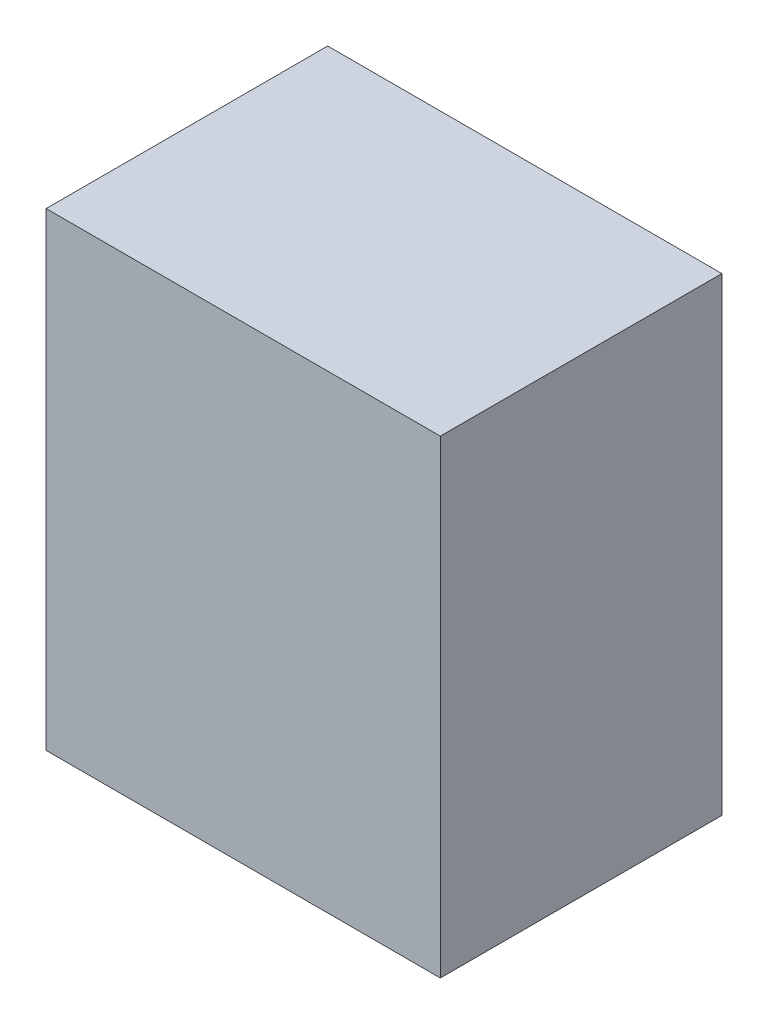
ISO-10303-21;
HEADER;
FILE_DESCRIPTION(('STEP AP214'),'2;1');
FILE_NAME('part.step','',(''),(''),'','','');
FILE_SCHEMA(('AUTOMOTIVE_DESIGN { 1 0 10303 214 1 1 1 1 }'));
ENDSEC;
DATA;
#1=APPLICATION_CONTEXT('core data for automotive mechanical design processes');
#2=APPLICATION_PROTOCOL_DEFINITION('international standard','automotive_design',2000,#1);
#3=PRODUCT_CONTEXT('',#1,'mechanical');
#4=PRODUCT('Part','Part','',(#3));
#5=PRODUCT_RELATED_PRODUCT_CATEGORY('part','',(#4));
#6=PRODUCT_DEFINITION_FORMATION('','',#4);
#7=PRODUCT_DEFINITION_CONTEXT('part definition',#1,'design');
#8=PRODUCT_DEFINITION('design','',#6,#7);
#9=PRODUCT_DEFINITION_SHAPE('','',#8);
#10=(LENGTH_UNIT() NAMED_UNIT(*) SI_UNIT(.MILLI.,.METRE.));
#11=(NAMED_UNIT(*) PLANE_ANGLE_UNIT() SI_UNIT($,.RADIAN.));
#12=(NAMED_UNIT(*) SI_UNIT($,.STERADIAN.) SOLID_ANGLE_UNIT());
#13=UNCERTAINTY_MEASURE_WITH_UNIT(LENGTH_MEASURE(1.E-05),#10,'distance_accuracy_value','');
#14=(GEOMETRIC_REPRESENTATION_CONTEXT(3) GLOBAL_UNCERTAINTY_ASSIGNED_CONTEXT((#13)) GLOBAL_UNIT_ASSIGNED_CONTEXT((#10,
#11,#12)) REPRESENTATION_CONTEXT('',''));
#15=CARTESIAN_POINT('',(0.,0.,0.));
#16=DIRECTION('',(0.,0.,1.));
#17=DIRECTION('',(1.,0.,0.));
#18=AXIS2_PLACEMENT_3D('',#15,#16,#17);
#19=CARTESIAN_POINT('',(20.052,-2.5,-19.55));
#20=DIRECTION('',(1.,0.,0.));
#21=DIRECTION('',(0.,0.,-1.));
#22=AXIS2_PLACEMENT_3D('',#19,#20,#21);
#23=PLANE('',#22);
#24=DIRECTION('',(0.,-1.,0.));
#25=VECTOR('',#24,1.);
#26=CARTESIAN_POINT('',(20.052,-2.5,-22.55));
#27=LINE('',#26,#25);
#28=CARTESIAN_POINT('',(20.052,2.5,-22.55));
#29=VERTEX_POINT('',#28);
#30=CARTESIAN_POINT('',(20.052,-2.5,-22.55));
#31=VERTEX_POINT('',#30);
#32=EDGE_CURVE('E78',#29,#31,#27,.T.);
#33=ORIENTED_EDGE('',*,*,#32,.T.);
#34=DIRECTION('',(0.,0.,-1.));
#35=VECTOR('',#34,1.);
#36=CARTESIAN_POINT('',(20.052,-2.5,-19.55));
#37=LINE('',#36,#35);
#38=CARTESIAN_POINT('',(20.052,-2.5,-19.55));
#39=VERTEX_POINT('',#38);
#40=EDGE_CURVE('E10',#39,#31,#37,.T.);
#41=ORIENTED_EDGE('',*,*,#40,.F.);
#42=DIRECTION('',(0.,-1.,0.));
#43=VECTOR('',#42,1.);
#44=CARTESIAN_POINT('',(20.052,-2.5,-19.55));
#45=LINE('',#44,#43);
#46=CARTESIAN_POINT('',(20.052,2.5,-19.55));
#47=VERTEX_POINT('',#46);
#48=EDGE_CURVE('E70',#47,#39,#45,.T.);
#49=ORIENTED_EDGE('',*,*,#48,.F.);
#50=DIRECTION('',(0.,0.,-1.));
#51=VECTOR('',#50,1.);
#52=CARTESIAN_POINT('',(20.052,2.5,-19.55));
#53=LINE('',#52,#51);
#54=EDGE_CURVE('E74',#47,#29,#53,.T.);
#55=ORIENTED_EDGE('',*,*,#54,.T.);
#56=EDGE_LOOP('',(#33,#41,#49,#55));
#57=FACE_BOUND('',#56,.T.);
#58=ADVANCED_FACE('F16',(#57),#23,.F.);
#59=CARTESIAN_POINT('',(20.052,-2.5,-19.55));
#60=DIRECTION('',(0.,1.,0.));
#61=DIRECTION('',(0.,0.,1.));
#62=AXIS2_PLACEMENT_3D('',#59,#60,#61);
#63=PLANE('',#62);
#64=DIRECTION('',(1.,0.,0.));
#65=VECTOR('',#64,1.);
#66=CARTESIAN_POINT('',(20.052,-2.5,-22.55));
#67=LINE('',#66,#65);
#68=CARTESIAN_POINT('',(24.252,-2.5,-22.55));
#69=VERTEX_POINT('',#68);
#70=EDGE_CURVE('E75',#31,#69,#67,.T.);
#71=ORIENTED_EDGE('',*,*,#70,.T.);
#72=DIRECTION('',(0.,0.,-1.));
#73=VECTOR('',#72,1.);
#74=CARTESIAN_POINT('',(24.252,-2.5,-19.55));
#75=LINE('',#74,#73);
#76=CARTESIAN_POINT('',(24.252,-2.5,-19.55));
#77=VERTEX_POINT('',#76);
#78=EDGE_CURVE('E24',#77,#69,#75,.T.);
#79=ORIENTED_EDGE('',*,*,#78,.F.);
#80=DIRECTION('',(1.,0.,0.));
#81=VECTOR('',#80,1.);
#82=CARTESIAN_POINT('',(20.052,-2.5,-19.55));
#83=LINE('',#82,#81);
#84=EDGE_CURVE('E62',#39,#77,#83,.T.);
#85=ORIENTED_EDGE('',*,*,#84,.F.);
#86=ORIENTED_EDGE('',*,*,#40,.T.);
#87=EDGE_LOOP('',(#71,#79,#85,#86));
#88=FACE_BOUND('',#87,.T.);
#89=ADVANCED_FACE('F69',(#88),#63,.F.);
#90=CARTESIAN_POINT('',(24.252,-2.5,-19.55));
#91=DIRECTION('',(-1.,0.,0.));
#92=DIRECTION('',(0.,0.,1.));
#93=AXIS2_PLACEMENT_3D('',#90,#91,#92);
#94=PLANE('',#93);
#95=DIRECTION('',(0.,1.,0.));
#96=VECTOR('',#95,1.);
#97=CARTESIAN_POINT('',(24.252,-2.5,-22.55));
#98=LINE('',#97,#96);
#99=CARTESIAN_POINT('',(24.252,2.5,-22.55));
#100=VERTEX_POINT('',#99);
#101=EDGE_CURVE('E47',#69,#100,#98,.T.);
#102=ORIENTED_EDGE('',*,*,#101,.T.);
#103=DIRECTION('',(0.,0.,-1.));
#104=VECTOR('',#103,1.);
#105=CARTESIAN_POINT('',(24.252,2.5,-19.55));
#106=LINE('',#105,#104);
#107=CARTESIAN_POINT('',(24.252,2.5,-19.55));
#108=VERTEX_POINT('',#107);
#109=EDGE_CURVE('E71',#108,#100,#106,.T.);
#110=ORIENTED_EDGE('',*,*,#109,.F.);
#111=DIRECTION('',(0.,1.,0.));
#112=VECTOR('',#111,1.);
#113=CARTESIAN_POINT('',(24.252,-2.5,-19.55));
#114=LINE('',#113,#112);
#115=EDGE_CURVE('E65',#77,#108,#114,.T.);
#116=ORIENTED_EDGE('',*,*,#115,.F.);
#117=ORIENTED_EDGE('',*,*,#78,.T.);
#118=EDGE_LOOP('',(#102,#110,#116,#117));
#119=FACE_BOUND('',#118,.T.);
#120=ADVANCED_FACE('F73',(#119),#94,.F.);
#121=CARTESIAN_POINT('',(20.052,2.5,-19.55));
#122=DIRECTION('',(0.,-1.,0.));
#123=DIRECTION('',(0.,0.,-1.));
#124=AXIS2_PLACEMENT_3D('',#121,#122,#123);
#125=PLANE('',#124);
#126=DIRECTION('',(-1.,0.,0.));
#127=VECTOR('',#126,1.);
#128=CARTESIAN_POINT('',(20.052,2.5,-22.55));
#129=LINE('',#128,#127);
#130=EDGE_CURVE('E54',#100,#29,#129,.T.);
#131=ORIENTED_EDGE('',*,*,#130,.T.);
#132=ORIENTED_EDGE('',*,*,#54,.F.);
#133=DIRECTION('',(-1.,0.,0.));
#134=VECTOR('',#133,1.);
#135=CARTESIAN_POINT('',(20.052,2.5,-19.55));
#136=LINE('',#135,#134);
#137=EDGE_CURVE('E32',#108,#47,#136,.T.);
#138=ORIENTED_EDGE('',*,*,#137,.F.);
#139=ORIENTED_EDGE('',*,*,#109,.T.);
#140=EDGE_LOOP('',(#131,#132,#138,#139));
#141=FACE_BOUND('',#140,.T.);
#142=ADVANCED_FACE('F88',(#141),#125,.F.);
#143=CARTESIAN_POINT('',(0.,0.,-19.55));
#144=DIRECTION('',(0.,0.,-1.));
#145=DIRECTION('',(-1.,0.,0.));
#146=AXIS2_PLACEMENT_3D('',#143,#144,#145);
#147=PLANE('',#146);
#148=ORIENTED_EDGE('',*,*,#48,.T.);
#149=ORIENTED_EDGE('',*,*,#84,.T.);
#150=ORIENTED_EDGE('',*,*,#115,.T.);
#151=ORIENTED_EDGE('',*,*,#137,.T.);
#152=EDGE_LOOP('',(#148,#149,#150,#151));
#153=FACE_BOUND('',#152,.T.);
#154=ADVANCED_FACE('F64',(#153),#147,.F.);
#155=CARTESIAN_POINT('',(0.,0.,-22.55));
#156=DIRECTION('',(0.,0.,-1.));
#157=DIRECTION('',(-1.,0.,0.));
#158=AXIS2_PLACEMENT_3D('',#155,#156,#157);
#159=PLANE('',#158);
#160=ORIENTED_EDGE('',*,*,#32,.F.);
#161=ORIENTED_EDGE('',*,*,#130,.F.);
#162=ORIENTED_EDGE('',*,*,#101,.F.);
#163=ORIENTED_EDGE('',*,*,#70,.F.);
#164=EDGE_LOOP('',(#160,#161,#162,#163));
#165=FACE_BOUND('',#164,.T.);
#166=ADVANCED_FACE('F90',(#165),#159,.T.);
#167=CLOSED_SHELL('',(#58,#89,#120,#142,#154,#166));
#168=MANIFOLD_SOLID_BREP('B1',#167);
#169=ADVANCED_BREP_SHAPE_REPRESENTATION('',(#18,#168),#14);
#170=SHAPE_DEFINITION_REPRESENTATION(#9,#169);
ENDSEC;
END-ISO-10303-21;
